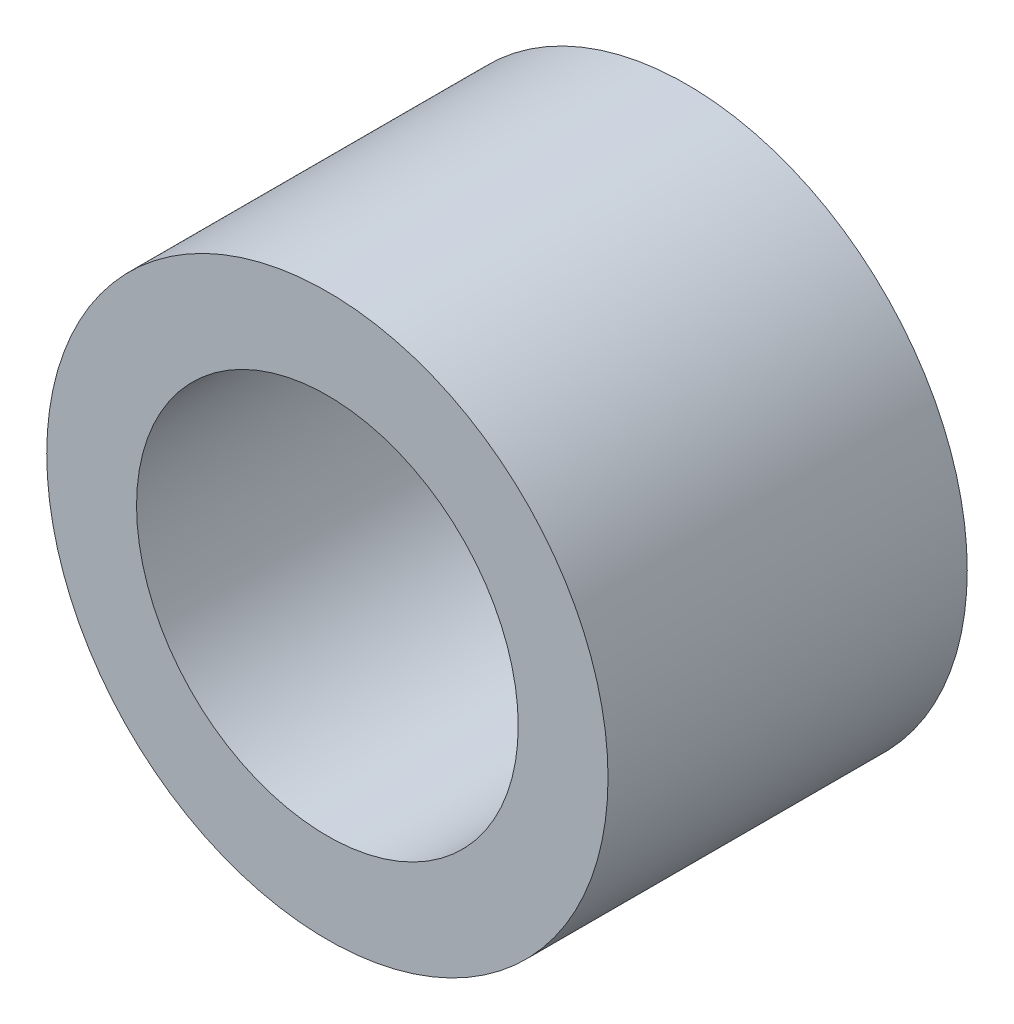
ISO-10303-21;
HEADER;
FILE_DESCRIPTION(('STEP AP214'),'2;1');
FILE_NAME('part.step','',(''),(''),'','','');
FILE_SCHEMA(('AUTOMOTIVE_DESIGN { 1 0 10303 214 1 1 1 1 }'));
ENDSEC;
DATA;
#1=APPLICATION_CONTEXT('core data for automotive mechanical design processes');
#2=APPLICATION_PROTOCOL_DEFINITION('international standard','automotive_design',2000,#1);
#3=PRODUCT_CONTEXT('',#1,'mechanical');
#4=PRODUCT('Part','Part','',(#3));
#5=PRODUCT_RELATED_PRODUCT_CATEGORY('part','',(#4));
#6=PRODUCT_DEFINITION_FORMATION('','',#4);
#7=PRODUCT_DEFINITION_CONTEXT('part definition',#1,'design');
#8=PRODUCT_DEFINITION('design','',#6,#7);
#9=PRODUCT_DEFINITION_SHAPE('','',#8);
#10=(LENGTH_UNIT() NAMED_UNIT(*) SI_UNIT(.MILLI.,.METRE.));
#11=(NAMED_UNIT(*) PLANE_ANGLE_UNIT() SI_UNIT($,.RADIAN.));
#12=(NAMED_UNIT(*) SI_UNIT($,.STERADIAN.) SOLID_ANGLE_UNIT());
#13=UNCERTAINTY_MEASURE_WITH_UNIT(LENGTH_MEASURE(1.E-05),#10,'distance_accuracy_value','');
#14=(GEOMETRIC_REPRESENTATION_CONTEXT(3) GLOBAL_UNCERTAINTY_ASSIGNED_CONTEXT((#13)) GLOBAL_UNIT_ASSIGNED_CONTEXT((#10,
#11,#12)) REPRESENTATION_CONTEXT('',''));
#15=CARTESIAN_POINT('',(0.,0.,0.));
#16=DIRECTION('',(0.,0.,1.));
#17=DIRECTION('',(1.,0.,0.));
#18=AXIS2_PLACEMENT_3D('',#15,#16,#17);
#19=CARTESIAN_POINT('',(0.,0.,63.5));
#20=DIRECTION('',(0.,0.,1.));
#21=DIRECTION('',(1.,0.,0.));
#22=AXIS2_PLACEMENT_3D('',#19,#20,#21);
#23=PLANE('',#22);
#24=CARTESIAN_POINT('',(0.,0.,63.5));
#25=DIRECTION('',(0.,0.,1.));
#26=DIRECTION('',(1.,0.,0.));
#27=AXIS2_PLACEMENT_3D('',#24,#25,#26);
#28=CIRCLE('',#27,12.5);
#29=CARTESIAN_POINT('',(12.5,0.,63.5));
#30=VERTEX_POINT('',#29);
#31=EDGE_CURVE('E10',#30,#30,#28,.T.);
#32=ORIENTED_EDGE('',*,*,#31,.T.);
#33=EDGE_LOOP('',(#32));
#34=FACE_BOUND('',#33,.T.);
#35=CARTESIAN_POINT('',(0.,0.,63.5));
#36=DIRECTION('',(0.,0.,1.));
#37=DIRECTION('',(1.,0.,0.));
#38=AXIS2_PLACEMENT_3D('',#35,#36,#37);
#39=CIRCLE('',#38,8.5);
#40=CARTESIAN_POINT('',(8.5,0.,63.5));
#41=VERTEX_POINT('',#40);
#42=EDGE_CURVE('E51',#41,#41,#39,.T.);
#43=ORIENTED_EDGE('',*,*,#42,.F.);
#44=EDGE_LOOP('',(#43));
#45=FACE_BOUND('',#44,.T.);
#46=ADVANCED_FACE('F36',(#34,#45),#23,.T.);
#47=CARTESIAN_POINT('',(0.,0.,47.5));
#48=DIRECTION('',(0.,0.,1.));
#49=DIRECTION('',(1.,0.,0.));
#50=AXIS2_PLACEMENT_3D('',#47,#48,#49);
#51=PLANE('',#50);
#52=CARTESIAN_POINT('',(0.,0.,47.5));
#53=DIRECTION('',(0.,0.,1.));
#54=DIRECTION('',(1.,0.,0.));
#55=AXIS2_PLACEMENT_3D('',#52,#53,#54);
#56=CIRCLE('',#55,12.5);
#57=CARTESIAN_POINT('',(12.5,0.,47.5));
#58=VERTEX_POINT('',#57);
#59=EDGE_CURVE('E40',#58,#58,#56,.T.);
#60=ORIENTED_EDGE('',*,*,#59,.F.);
#61=EDGE_LOOP('',(#60));
#62=FACE_BOUND('',#61,.T.);
#63=CARTESIAN_POINT('',(0.,0.,47.5));
#64=DIRECTION('',(0.,0.,1.));
#65=DIRECTION('',(1.,0.,0.));
#66=AXIS2_PLACEMENT_3D('',#63,#64,#65);
#67=CIRCLE('',#66,8.5);
#68=CARTESIAN_POINT('',(8.5,0.,47.5));
#69=VERTEX_POINT('',#68);
#70=EDGE_CURVE('E53',#69,#69,#67,.T.);
#71=ORIENTED_EDGE('',*,*,#70,.T.);
#72=EDGE_LOOP('',(#71));
#73=FACE_BOUND('',#72,.T.);
#74=ADVANCED_FACE('F63',(#62,#73),#51,.F.);
#75=CARTESIAN_POINT('',(0.,0.,63.5));
#76=DIRECTION('',(0.,0.,-1.));
#77=DIRECTION('',(-1.,0.,0.));
#78=AXIS2_PLACEMENT_3D('',#75,#76,#77);
#79=CYLINDRICAL_SURFACE('',#78,12.5);
#80=ORIENTED_EDGE('',*,*,#31,.F.);
#81=EDGE_LOOP('',(#80));
#82=FACE_BOUND('',#81,.T.);
#83=ORIENTED_EDGE('',*,*,#59,.T.);
#84=EDGE_LOOP('',(#83));
#85=FACE_BOUND('',#84,.T.);
#86=ADVANCED_FACE('F38',(#82,#85),#79,.T.);
#87=CARTESIAN_POINT('',(0.,0.,63.5));
#88=DIRECTION('',(0.,0.,-1.));
#89=DIRECTION('',(-1.,0.,0.));
#90=AXIS2_PLACEMENT_3D('',#87,#88,#89);
#91=CYLINDRICAL_SURFACE('',#90,8.5);
#92=ORIENTED_EDGE('',*,*,#42,.T.);
#93=EDGE_LOOP('',(#92));
#94=FACE_BOUND('',#93,.T.);
#95=ORIENTED_EDGE('',*,*,#70,.F.);
#96=EDGE_LOOP('',(#95));
#97=FACE_BOUND('',#96,.T.);
#98=ADVANCED_FACE('F59',(#94,#97),#91,.F.);
#99=CLOSED_SHELL('',(#46,#74,#86,#98));
#100=MANIFOLD_SOLID_BREP('B2',#99);
#101=ADVANCED_BREP_SHAPE_REPRESENTATION('',(#18,#100),#14);
#102=SHAPE_DEFINITION_REPRESENTATION(#9,#101);
ENDSEC;
END-ISO-10303-21;
